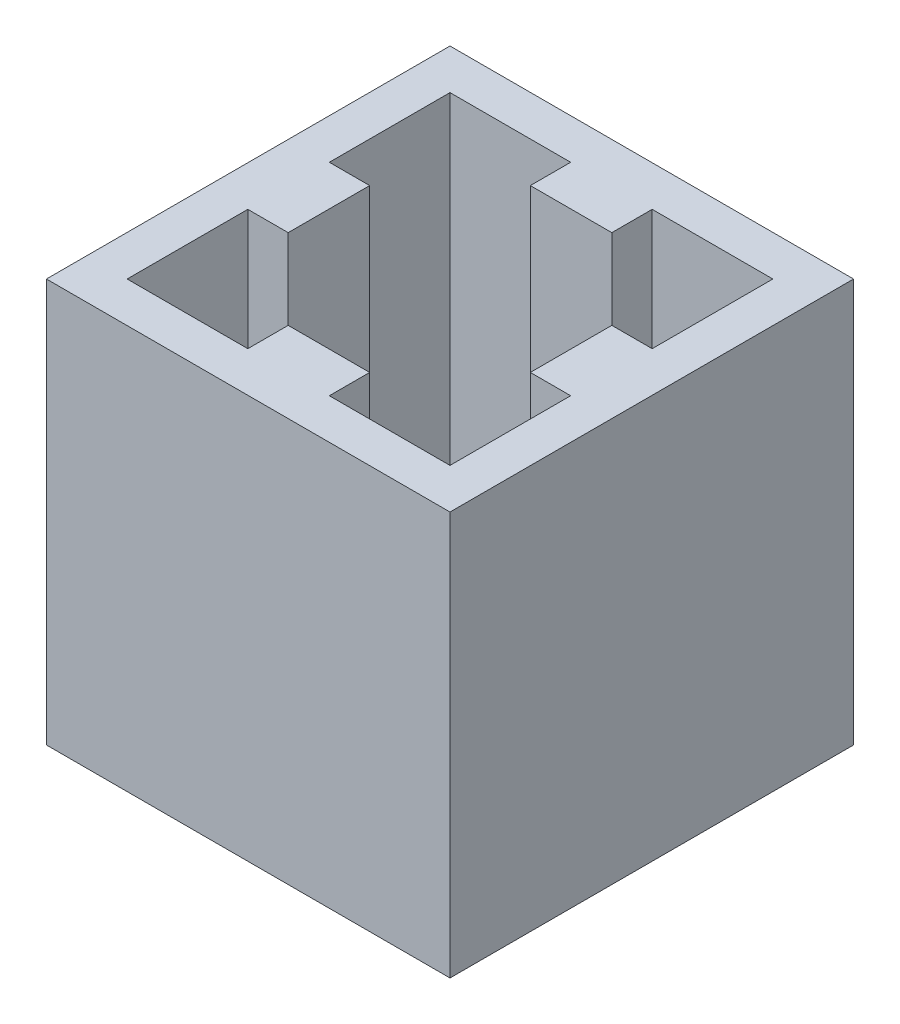
ISO-10303-21;
HEADER;
FILE_DESCRIPTION(('STEP AP214'),'2;1');
FILE_NAME('part.step','',(''),(''),'','','');
FILE_SCHEMA(('AUTOMOTIVE_DESIGN { 1 0 10303 214 1 1 1 1 }'));
ENDSEC;
DATA;
#1=APPLICATION_CONTEXT('core data for automotive mechanical design processes');
#2=APPLICATION_PROTOCOL_DEFINITION('international standard','automotive_design',2000,#1);
#3=PRODUCT_CONTEXT('',#1,'mechanical');
#4=PRODUCT('Part','Part','',(#3));
#5=PRODUCT_RELATED_PRODUCT_CATEGORY('part','',(#4));
#6=PRODUCT_DEFINITION_FORMATION('','',#4);
#7=PRODUCT_DEFINITION_CONTEXT('part definition',#1,'design');
#8=PRODUCT_DEFINITION('design','',#6,#7);
#9=PRODUCT_DEFINITION_SHAPE('','',#8);
#10=(LENGTH_UNIT() NAMED_UNIT(*) SI_UNIT(.MILLI.,.METRE.));
#11=(NAMED_UNIT(*) PLANE_ANGLE_UNIT() SI_UNIT($,.RADIAN.));
#12=(NAMED_UNIT(*) SI_UNIT($,.STERADIAN.) SOLID_ANGLE_UNIT());
#13=UNCERTAINTY_MEASURE_WITH_UNIT(LENGTH_MEASURE(1.E-05),#10,'distance_accuracy_value','');
#14=(GEOMETRIC_REPRESENTATION_CONTEXT(3) GLOBAL_UNCERTAINTY_ASSIGNED_CONTEXT((#13)) GLOBAL_UNIT_ASSIGNED_CONTEXT((#10,
#11,#12)) REPRESENTATION_CONTEXT('',''));
#15=CARTESIAN_POINT('',(0.,0.,0.));
#16=DIRECTION('',(0.,0.,1.));
#17=DIRECTION('',(1.,0.,0.));
#18=AXIS2_PLACEMENT_3D('',#15,#16,#17);
#19=CARTESIAN_POINT('',(-12.7,25.4,-12.7));
#20=DIRECTION('',(0.,0.,-1.));
#21=DIRECTION('',(-1.,0.,0.));
#22=AXIS2_PLACEMENT_3D('',#19,#20,#21);
#23=PLANE('',#22);
#24=DIRECTION('',(1.,0.,0.));
#25=VECTOR('',#24,1.);
#26=CARTESIAN_POINT('',(-12.7,0.,-12.7));
#27=LINE('',#26,#25);
#28=CARTESIAN_POINT('',(-12.7,0.,-12.7));
#29=VERTEX_POINT('',#28);
#30=CARTESIAN_POINT('',(12.7,0.,-12.7));
#31=VERTEX_POINT('',#30);
#32=EDGE_CURVE('E338',#29,#31,#27,.T.);
#33=ORIENTED_EDGE('',*,*,#32,.F.);
#34=DIRECTION('',(0.,-1.,0.));
#35=VECTOR('',#34,1.);
#36=CARTESIAN_POINT('',(-12.7,25.4,-12.7));
#37=LINE('',#36,#35);
#38=CARTESIAN_POINT('',(-12.7,25.4,-12.7));
#39=VERTEX_POINT('',#38);
#40=EDGE_CURVE('E11',#39,#29,#37,.T.);
#41=ORIENTED_EDGE('',*,*,#40,.F.);
#42=DIRECTION('',(1.,0.,0.));
#43=VECTOR('',#42,1.);
#44=CARTESIAN_POINT('',(-12.7,25.4,-12.7));
#45=LINE('',#44,#43);
#46=CARTESIAN_POINT('',(12.7,25.4,-12.7));
#47=VERTEX_POINT('',#46);
#48=EDGE_CURVE('E374',#39,#47,#45,.T.);
#49=ORIENTED_EDGE('',*,*,#48,.T.);
#50=DIRECTION('',(0.,-1.,0.));
#51=VECTOR('',#50,1.);
#52=CARTESIAN_POINT('',(12.7,25.4,-12.7));
#53=LINE('',#52,#51);
#54=EDGE_CURVE('E42',#47,#31,#53,.T.);
#55=ORIENTED_EDGE('',*,*,#54,.T.);
#56=EDGE_LOOP('',(#33,#41,#49,#55));
#57=FACE_BOUND('',#56,.T.);
#58=ADVANCED_FACE('F39',(#57),#23,.T.);
#59=CARTESIAN_POINT('',(-12.7,25.4,12.7));
#60=DIRECTION('',(-1.,0.,0.));
#61=DIRECTION('',(0.,0.,1.));
#62=AXIS2_PLACEMENT_3D('',#59,#60,#61);
#63=PLANE('',#62);
#64=DIRECTION('',(0.,0.,-1.));
#65=VECTOR('',#64,1.);
#66=CARTESIAN_POINT('',(-12.7,0.,12.7));
#67=LINE('',#66,#65);
#68=CARTESIAN_POINT('',(-12.7,0.,12.7));
#69=VERTEX_POINT('',#68);
#70=EDGE_CURVE('E376',#69,#29,#67,.T.);
#71=ORIENTED_EDGE('',*,*,#70,.F.);
#72=DIRECTION('',(0.,-1.,0.));
#73=VECTOR('',#72,1.);
#74=CARTESIAN_POINT('',(-12.7,25.4,12.7));
#75=LINE('',#74,#73);
#76=CARTESIAN_POINT('',(-12.7,25.4,12.7));
#77=VERTEX_POINT('',#76);
#78=EDGE_CURVE('E47',#77,#69,#75,.T.);
#79=ORIENTED_EDGE('',*,*,#78,.F.);
#80=DIRECTION('',(0.,0.,-1.));
#81=VECTOR('',#80,1.);
#82=CARTESIAN_POINT('',(-12.7,25.4,12.7));
#83=LINE('',#82,#81);
#84=EDGE_CURVE('E380',#77,#39,#83,.T.);
#85=ORIENTED_EDGE('',*,*,#84,.T.);
#86=ORIENTED_EDGE('',*,*,#40,.T.);
#87=EDGE_LOOP('',(#71,#79,#85,#86));
#88=FACE_BOUND('',#87,.T.);
#89=ADVANCED_FACE('F400',(#88),#63,.T.);
#90=CARTESIAN_POINT('',(-12.7,25.4,12.7));
#91=DIRECTION('',(0.,0.,-1.));
#92=DIRECTION('',(-1.,0.,0.));
#93=AXIS2_PLACEMENT_3D('',#90,#91,#92);
#94=PLANE('',#93);
#95=DIRECTION('',(1.,0.,0.));
#96=VECTOR('',#95,1.);
#97=CARTESIAN_POINT('',(-12.7,0.,12.7));
#98=LINE('',#97,#96);
#99=CARTESIAN_POINT('',(12.7,0.,12.7));
#100=VERTEX_POINT('',#99);
#101=EDGE_CURVE('E387',#69,#100,#98,.T.);
#102=ORIENTED_EDGE('',*,*,#101,.T.);
#103=DIRECTION('',(0.,-1.,0.));
#104=VECTOR('',#103,1.);
#105=CARTESIAN_POINT('',(12.7,25.4,12.7));
#106=LINE('',#105,#104);
#107=CARTESIAN_POINT('',(12.7,25.4,12.7));
#108=VERTEX_POINT('',#107);
#109=EDGE_CURVE('E391',#108,#100,#106,.T.);
#110=ORIENTED_EDGE('',*,*,#109,.F.);
#111=DIRECTION('',(1.,0.,0.));
#112=VECTOR('',#111,1.);
#113=CARTESIAN_POINT('',(-12.7,25.4,12.7));
#114=LINE('',#113,#112);
#115=EDGE_CURVE('E378',#77,#108,#114,.T.);
#116=ORIENTED_EDGE('',*,*,#115,.F.);
#117=ORIENTED_EDGE('',*,*,#78,.T.);
#118=EDGE_LOOP('',(#102,#110,#116,#117));
#119=FACE_BOUND('',#118,.T.);
#120=ADVANCED_FACE('F404',(#119),#94,.F.);
#121=CARTESIAN_POINT('',(12.7,25.4,12.7));
#122=DIRECTION('',(-1.,0.,0.));
#123=DIRECTION('',(0.,0.,1.));
#124=AXIS2_PLACEMENT_3D('',#121,#122,#123);
#125=PLANE('',#124);
#126=DIRECTION('',(0.,0.,-1.));
#127=VECTOR('',#126,1.);
#128=CARTESIAN_POINT('',(12.7,0.,12.7));
#129=LINE('',#128,#127);
#130=EDGE_CURVE('E384',#100,#31,#129,.T.);
#131=ORIENTED_EDGE('',*,*,#130,.T.);
#132=ORIENTED_EDGE('',*,*,#54,.F.);
#133=DIRECTION('',(0.,0.,-1.));
#134=VECTOR('',#133,1.);
#135=CARTESIAN_POINT('',(12.7,25.4,12.7));
#136=LINE('',#135,#134);
#137=EDGE_CURVE('E88',#108,#47,#136,.T.);
#138=ORIENTED_EDGE('',*,*,#137,.F.);
#139=ORIENTED_EDGE('',*,*,#109,.T.);
#140=EDGE_LOOP('',(#131,#132,#138,#139));
#141=FACE_BOUND('',#140,.T.);
#142=ADVANCED_FACE('F396',(#141),#125,.F.);
#143=CARTESIAN_POINT('',(0.,25.4,0.));
#144=DIRECTION('',(0.,1.,0.));
#145=DIRECTION('',(0.,0.,1.));
#146=AXIS2_PLACEMENT_3D('',#143,#144,#145);
#147=PLANE('',#146);
#148=DIRECTION('',(0.,0.,-1.));
#149=VECTOR('',#148,1.);
#150=CARTESIAN_POINT('',(10.16,25.4,-2.56512278395392));
#151=LINE('',#150,#149);
#152=CARTESIAN_POINT('',(10.16,25.4,-2.56512278395392));
#153=VERTEX_POINT('',#152);
#154=CARTESIAN_POINT('',(10.16,25.4,-10.16));
#155=VERTEX_POINT('',#154);
#156=EDGE_CURVE('E55',#153,#155,#151,.T.);
#157=ORIENTED_EDGE('',*,*,#156,.F.);
#158=DIRECTION('',(1.,0.,0.));
#159=VECTOR('',#158,1.);
#160=CARTESIAN_POINT('',(10.16,25.4,-2.56512278395392));
#161=LINE('',#160,#159);
#162=CARTESIAN_POINT('',(7.62,25.4,-2.56512278395392));
#163=VERTEX_POINT('',#162);
#164=EDGE_CURVE('E228',#163,#153,#161,.T.);
#165=ORIENTED_EDGE('',*,*,#164,.F.);
#166=DIRECTION('',(0.,0.,-1.));
#167=VECTOR('',#166,1.);
#168=CARTESIAN_POINT('',(7.62,25.4,-2.56512278395392));
#169=LINE('',#168,#167);
#170=CARTESIAN_POINT('',(7.62,25.4,2.56512278395392));
#171=VERTEX_POINT('',#170);
#172=EDGE_CURVE('E231',#171,#163,#169,.T.);
#173=ORIENTED_EDGE('',*,*,#172,.F.);
#174=DIRECTION('',(-1.,0.,0.));
#175=VECTOR('',#174,1.);
#176=CARTESIAN_POINT('',(7.62,25.4,2.56512278395392));
#177=LINE('',#176,#175);
#178=CARTESIAN_POINT('',(10.16,25.4,2.56512278395392));
#179=VERTEX_POINT('',#178);
#180=EDGE_CURVE('E331',#179,#171,#177,.T.);
#181=ORIENTED_EDGE('',*,*,#180,.F.);
#182=DIRECTION('',(0.,0.,-1.));
#183=VECTOR('',#182,1.);
#184=CARTESIAN_POINT('',(10.16,25.4,10.16));
#185=LINE('',#184,#183);
#186=CARTESIAN_POINT('',(10.16,25.4,10.16));
#187=VERTEX_POINT('',#186);
#188=EDGE_CURVE('E328',#187,#179,#185,.T.);
#189=ORIENTED_EDGE('',*,*,#188,.F.);
#190=DIRECTION('',(1.,0.,0.));
#191=VECTOR('',#190,1.);
#192=CARTESIAN_POINT('',(2.56512278395389,25.4,10.16));
#193=LINE('',#192,#191);
#194=CARTESIAN_POINT('',(2.56512278395389,25.4,10.16));
#195=VERTEX_POINT('',#194);
#196=EDGE_CURVE('E325',#195,#187,#193,.T.);
#197=ORIENTED_EDGE('',*,*,#196,.F.);
#198=DIRECTION('',(0.,0.,1.));
#199=VECTOR('',#198,1.);
#200=CARTESIAN_POINT('',(2.56512278395389,25.4,10.16));
#201=LINE('',#200,#199);
#202=CARTESIAN_POINT('',(2.56512278395389,25.4,7.62000000000001));
#203=VERTEX_POINT('',#202);
#204=EDGE_CURVE('E322',#203,#195,#201,.T.);
#205=ORIENTED_EDGE('',*,*,#204,.F.);
#206=DIRECTION('',(1.,0.,0.));
#207=VECTOR('',#206,1.);
#208=CARTESIAN_POINT('',(2.56512278395389,25.4,7.62000000000001));
#209=LINE('',#208,#207);
#210=CARTESIAN_POINT('',(-2.56512278395395,25.4,7.61999999999999));
#211=VERTEX_POINT('',#210);
#212=EDGE_CURVE('E319',#211,#203,#209,.T.);
#213=ORIENTED_EDGE('',*,*,#212,.F.);
#214=DIRECTION('',(0.,0.,-1.));
#215=VECTOR('',#214,1.);
#216=CARTESIAN_POINT('',(-2.56512278395395,25.4,7.61999999999999));
#217=LINE('',#216,#215);
#218=CARTESIAN_POINT('',(-2.56512278395396,25.4,10.16));
#219=VERTEX_POINT('',#218);
#220=EDGE_CURVE('E316',#219,#211,#217,.T.);
#221=ORIENTED_EDGE('',*,*,#220,.F.);
#222=DIRECTION('',(1.,0.,0.));
#223=VECTOR('',#222,1.);
#224=CARTESIAN_POINT('',(-10.16,25.4,10.16));
#225=LINE('',#224,#223);
#226=CARTESIAN_POINT('',(-10.16,25.4,10.16));
#227=VERTEX_POINT('',#226);
#228=EDGE_CURVE('E313',#227,#219,#225,.T.);
#229=ORIENTED_EDGE('',*,*,#228,.F.);
#230=DIRECTION('',(0.,0.,1.));
#231=VECTOR('',#230,1.);
#232=CARTESIAN_POINT('',(-10.16,25.4,2.56512278395385));
#233=LINE('',#232,#231);
#234=CARTESIAN_POINT('',(-10.16,25.4,2.56512278395385));
#235=VERTEX_POINT('',#234);
#236=EDGE_CURVE('E310',#235,#227,#233,.T.);
#237=ORIENTED_EDGE('',*,*,#236,.F.);
#238=DIRECTION('',(-1.,0.,0.));
#239=VECTOR('',#238,1.);
#240=CARTESIAN_POINT('',(-10.16,25.4,2.56512278395385));
#241=LINE('',#240,#239);
#242=CARTESIAN_POINT('',(-7.62000000000001,25.4,2.56512278395387));
#243=VERTEX_POINT('',#242);
#244=EDGE_CURVE('E307',#243,#235,#241,.T.);
#245=ORIENTED_EDGE('',*,*,#244,.F.);
#246=DIRECTION('',(0.,0.,1.));
#247=VECTOR('',#246,1.);
#248=CARTESIAN_POINT('',(-7.62000000000001,25.4,2.56512278395387));
#249=LINE('',#248,#247);
#250=CARTESIAN_POINT('',(-7.61999999999998,25.4,-2.56512278395397));
#251=VERTEX_POINT('',#250);
#252=EDGE_CURVE('E304',#251,#243,#249,.T.);
#253=ORIENTED_EDGE('',*,*,#252,.F.);
#254=DIRECTION('',(1.,0.,0.));
#255=VECTOR('',#254,1.);
#256=CARTESIAN_POINT('',(-7.61999999999998,25.4,-2.56512278395397));
#257=LINE('',#256,#255);
#258=CARTESIAN_POINT('',(-10.16,25.4,-2.56512278395399));
#259=VERTEX_POINT('',#258);
#260=EDGE_CURVE('E301',#259,#251,#257,.T.);
#261=ORIENTED_EDGE('',*,*,#260,.F.);
#262=DIRECTION('',(0.,0.,1.));
#263=VECTOR('',#262,1.);
#264=CARTESIAN_POINT('',(-10.16,25.4,-10.16));
#265=LINE('',#264,#263);
#266=CARTESIAN_POINT('',(-10.16,25.4,-10.16));
#267=VERTEX_POINT('',#266);
#268=EDGE_CURVE('E298',#267,#259,#265,.T.);
#269=ORIENTED_EDGE('',*,*,#268,.F.);
#270=DIRECTION('',(-1.,0.,0.));
#271=VECTOR('',#270,1.);
#272=CARTESIAN_POINT('',(-2.56512278395382,25.4,-10.16));
#273=LINE('',#272,#271);
#274=CARTESIAN_POINT('',(-2.56512278395382,25.4,-10.16));
#275=VERTEX_POINT('',#274);
#276=EDGE_CURVE('E295',#275,#267,#273,.T.);
#277=ORIENTED_EDGE('',*,*,#276,.F.);
#278=DIRECTION('',(0.,0.,-1.));
#279=VECTOR('',#278,1.);
#280=CARTESIAN_POINT('',(-2.56512278395382,25.4,-10.16));
#281=LINE('',#280,#279);
#282=CARTESIAN_POINT('',(-2.56512278395384,25.4,-7.62000000000002));
#283=VERTEX_POINT('',#282);
#284=EDGE_CURVE('E292',#283,#275,#281,.T.);
#285=ORIENTED_EDGE('',*,*,#284,.F.);
#286=DIRECTION('',(-1.,0.,0.));
#287=VECTOR('',#286,1.);
#288=CARTESIAN_POINT('',(-2.56512278395384,25.4,-7.62000000000002));
#289=LINE('',#288,#287);
#290=CARTESIAN_POINT('',(2.565122783954,25.4,-7.61999999999997));
#291=VERTEX_POINT('',#290);
#292=EDGE_CURVE('E289',#291,#283,#289,.T.);
#293=ORIENTED_EDGE('',*,*,#292,.F.);
#294=DIRECTION('',(0.,0.,1.));
#295=VECTOR('',#294,1.);
#296=CARTESIAN_POINT('',(2.565122783954,25.4,-7.61999999999997));
#297=LINE('',#296,#295);
#298=CARTESIAN_POINT('',(2.56512278395403,25.4,-10.16));
#299=VERTEX_POINT('',#298);
#300=EDGE_CURVE('E286',#299,#291,#297,.T.);
#301=ORIENTED_EDGE('',*,*,#300,.F.);
#302=DIRECTION('',(-1.,0.,0.));
#303=VECTOR('',#302,1.);
#304=CARTESIAN_POINT('',(10.16,25.4,-10.16));
#305=LINE('',#304,#303);
#306=EDGE_CURVE('E284',#155,#299,#305,.T.);
#307=ORIENTED_EDGE('',*,*,#306,.F.);
#308=EDGE_LOOP('',(#157,#165,#173,#181,#189,#197,#205,#213,#221,#229,#237,#245,#253,#261,#269,
#277,#285,#293,#301,#307));
#309=FACE_BOUND('',#308,.T.);
#310=ORIENTED_EDGE('',*,*,#48,.F.);
#311=ORIENTED_EDGE('',*,*,#84,.F.);
#312=ORIENTED_EDGE('',*,*,#115,.T.);
#313=ORIENTED_EDGE('',*,*,#137,.T.);
#314=EDGE_LOOP('',(#310,#311,#312,#313));
#315=FACE_BOUND('',#314,.T.);
#316=ADVANCED_FACE('F405',(#309,#315),#147,.T.);
#317=CARTESIAN_POINT('',(0.,0.,0.));
#318=DIRECTION('',(0.,1.,0.));
#319=DIRECTION('',(0.,0.,1.));
#320=AXIS2_PLACEMENT_3D('',#317,#318,#319);
#321=PLANE('',#320);
#322=ORIENTED_EDGE('',*,*,#32,.T.);
#323=ORIENTED_EDGE('',*,*,#130,.F.);
#324=ORIENTED_EDGE('',*,*,#101,.F.);
#325=ORIENTED_EDGE('',*,*,#70,.T.);
#326=EDGE_LOOP('',(#322,#323,#324,#325));
#327=FACE_BOUND('',#326,.T.);
#328=ADVANCED_FACE('F399',(#327),#321,.F.);
#329=CARTESIAN_POINT('',(10.16,2.54,-2.56512278395392));
#330=DIRECTION('',(1.,0.,0.));
#331=DIRECTION('',(0.,0.,-1.));
#332=AXIS2_PLACEMENT_3D('',#329,#330,#331);
#333=PLANE('',#332);
#334=ORIENTED_EDGE('',*,*,#156,.T.);
#335=DIRECTION('',(0.,1.,0.));
#336=VECTOR('',#335,1.);
#337=CARTESIAN_POINT('',(10.16,2.54,-10.16));
#338=LINE('',#337,#336);
#339=CARTESIAN_POINT('',(10.16,2.54,-10.16));
#340=VERTEX_POINT('',#339);
#341=EDGE_CURVE('E205',#340,#155,#338,.T.);
#342=ORIENTED_EDGE('',*,*,#341,.F.);
#343=DIRECTION('',(0.,0.,-1.));
#344=VECTOR('',#343,1.);
#345=CARTESIAN_POINT('',(10.16,2.54,-2.56512278395392));
#346=LINE('',#345,#344);
#347=CARTESIAN_POINT('',(10.16,2.54,-2.56512278395392));
#348=VERTEX_POINT('',#347);
#349=EDGE_CURVE('E209',#348,#340,#346,.T.);
#350=ORIENTED_EDGE('',*,*,#349,.F.);
#351=DIRECTION('',(0.,1.,0.));
#352=VECTOR('',#351,1.);
#353=CARTESIAN_POINT('',(10.16,2.54,-2.56512278395392));
#354=LINE('',#353,#352);
#355=EDGE_CURVE('E336',#348,#153,#354,.T.);
#356=ORIENTED_EDGE('',*,*,#355,.T.);
#357=EDGE_LOOP('',(#334,#342,#350,#356));
#358=FACE_BOUND('',#357,.T.);
#359=ADVANCED_FACE('F207',(#358),#333,.F.);
#360=CARTESIAN_POINT('',(10.16,2.54,-2.56512278395392));
#361=DIRECTION('',(0.,0.,1.));
#362=DIRECTION('',(1.,0.,0.));
#363=AXIS2_PLACEMENT_3D('',#360,#361,#362);
#364=PLANE('',#363);
#365=ORIENTED_EDGE('',*,*,#164,.T.);
#366=ORIENTED_EDGE('',*,*,#355,.F.);
#367=DIRECTION('',(1.,0.,0.));
#368=VECTOR('',#367,1.);
#369=CARTESIAN_POINT('',(10.16,2.54,-2.56512278395392));
#370=LINE('',#369,#368);
#371=CARTESIAN_POINT('',(7.62,2.54,-2.56512278395392));
#372=VERTEX_POINT('',#371);
#373=EDGE_CURVE('E215',#372,#348,#370,.T.);
#374=ORIENTED_EDGE('',*,*,#373,.F.);
#375=DIRECTION('',(0.,1.,0.));
#376=VECTOR('',#375,1.);
#377=CARTESIAN_POINT('',(7.62,2.54,-2.56512278395392));
#378=LINE('',#377,#376);
#379=EDGE_CURVE('E339',#372,#163,#378,.T.);
#380=ORIENTED_EDGE('',*,*,#379,.T.);
#381=EDGE_LOOP('',(#365,#366,#374,#380));
#382=FACE_BOUND('',#381,.T.);
#383=ADVANCED_FACE('F452',(#382),#364,.F.);
#384=CARTESIAN_POINT('',(7.62,2.54,-2.56512278395392));
#385=DIRECTION('',(1.,0.,0.));
#386=DIRECTION('',(0.,0.,-1.));
#387=AXIS2_PLACEMENT_3D('',#384,#385,#386);
#388=PLANE('',#387);
#389=ORIENTED_EDGE('',*,*,#172,.T.);
#390=ORIENTED_EDGE('',*,*,#379,.F.);
#391=DIRECTION('',(0.,0.,-1.));
#392=VECTOR('',#391,1.);
#393=CARTESIAN_POINT('',(7.62,2.54,-2.56512278395392));
#394=LINE('',#393,#392);
#395=CARTESIAN_POINT('',(7.62,2.54,2.56512278395392));
#396=VERTEX_POINT('',#395);
#397=EDGE_CURVE('E280',#396,#372,#394,.T.);
#398=ORIENTED_EDGE('',*,*,#397,.F.);
#399=DIRECTION('',(0.,1.,0.));
#400=VECTOR('',#399,1.);
#401=CARTESIAN_POINT('',(7.62,2.54,2.56512278395392));
#402=LINE('',#401,#400);
#403=EDGE_CURVE('E341',#396,#171,#402,.T.);
#404=ORIENTED_EDGE('',*,*,#403,.T.);
#405=EDGE_LOOP('',(#389,#390,#398,#404));
#406=FACE_BOUND('',#405,.T.);
#407=ADVANCED_FACE('F461',(#406),#388,.F.);
#408=CARTESIAN_POINT('',(7.62,2.54,2.56512278395392));
#409=DIRECTION('',(0.,0.,-1.));
#410=DIRECTION('',(-1.,0.,0.));
#411=AXIS2_PLACEMENT_3D('',#408,#409,#410);
#412=PLANE('',#411);
#413=ORIENTED_EDGE('',*,*,#180,.T.);
#414=ORIENTED_EDGE('',*,*,#403,.F.);
#415=DIRECTION('',(-1.,0.,0.));
#416=VECTOR('',#415,1.);
#417=CARTESIAN_POINT('',(7.62,2.54,2.56512278395392));
#418=LINE('',#417,#416);
#419=CARTESIAN_POINT('',(10.16,2.54,2.56512278395392));
#420=VERTEX_POINT('',#419);
#421=EDGE_CURVE('E277',#420,#396,#418,.T.);
#422=ORIENTED_EDGE('',*,*,#421,.F.);
#423=DIRECTION('',(0.,1.,0.));
#424=VECTOR('',#423,1.);
#425=CARTESIAN_POINT('',(10.16,2.54,2.56512278395392));
#426=LINE('',#425,#424);
#427=EDGE_CURVE('E343',#420,#179,#426,.T.);
#428=ORIENTED_EDGE('',*,*,#427,.T.);
#429=EDGE_LOOP('',(#413,#414,#422,#428));
#430=FACE_BOUND('',#429,.T.);
#431=ADVANCED_FACE('F472',(#430),#412,.F.);
#432=CARTESIAN_POINT('',(10.16,2.54,10.16));
#433=DIRECTION('',(1.,0.,0.));
#434=DIRECTION('',(0.,0.,-1.));
#435=AXIS2_PLACEMENT_3D('',#432,#433,#434);
#436=PLANE('',#435);
#437=ORIENTED_EDGE('',*,*,#188,.T.);
#438=ORIENTED_EDGE('',*,*,#427,.F.);
#439=DIRECTION('',(0.,0.,-1.));
#440=VECTOR('',#439,1.);
#441=CARTESIAN_POINT('',(10.16,2.54,10.16));
#442=LINE('',#441,#440);
#443=CARTESIAN_POINT('',(10.16,2.54,10.16));
#444=VERTEX_POINT('',#443);
#445=EDGE_CURVE('E274',#444,#420,#442,.T.);
#446=ORIENTED_EDGE('',*,*,#445,.F.);
#447=DIRECTION('',(0.,1.,0.));
#448=VECTOR('',#447,1.);
#449=CARTESIAN_POINT('',(10.16,2.54,10.16));
#450=LINE('',#449,#448);
#451=EDGE_CURVE('E345',#444,#187,#450,.T.);
#452=ORIENTED_EDGE('',*,*,#451,.T.);
#453=EDGE_LOOP('',(#437,#438,#446,#452));
#454=FACE_BOUND('',#453,.T.);
#455=ADVANCED_FACE('F483',(#454),#436,.F.);
#456=CARTESIAN_POINT('',(2.56512278395389,2.54,10.16));
#457=DIRECTION('',(0.,0.,1.));
#458=DIRECTION('',(1.,0.,0.));
#459=AXIS2_PLACEMENT_3D('',#456,#457,#458);
#460=PLANE('',#459);
#461=ORIENTED_EDGE('',*,*,#196,.T.);
#462=ORIENTED_EDGE('',*,*,#451,.F.);
#463=DIRECTION('',(1.,0.,0.));
#464=VECTOR('',#463,1.);
#465=CARTESIAN_POINT('',(2.56512278395389,2.54,10.16));
#466=LINE('',#465,#464);
#467=CARTESIAN_POINT('',(2.56512278395389,2.54,10.16));
#468=VERTEX_POINT('',#467);
#469=EDGE_CURVE('E271',#468,#444,#466,.T.);
#470=ORIENTED_EDGE('',*,*,#469,.F.);
#471=DIRECTION('',(0.,1.,0.));
#472=VECTOR('',#471,1.);
#473=CARTESIAN_POINT('',(2.56512278395389,2.54,10.16));
#474=LINE('',#473,#472);
#475=EDGE_CURVE('E347',#468,#195,#474,.T.);
#476=ORIENTED_EDGE('',*,*,#475,.T.);
#477=EDGE_LOOP('',(#461,#462,#470,#476));
#478=FACE_BOUND('',#477,.T.);
#479=ADVANCED_FACE('F494',(#478),#460,.F.);
#480=CARTESIAN_POINT('',(2.56512278395389,2.54,10.16));
#481=DIRECTION('',(-1.,0.,0.));
#482=DIRECTION('',(0.,0.,1.));
#483=AXIS2_PLACEMENT_3D('',#480,#481,#482);
#484=PLANE('',#483);
#485=ORIENTED_EDGE('',*,*,#204,.T.);
#486=ORIENTED_EDGE('',*,*,#475,.F.);
#487=DIRECTION('',(0.,0.,1.));
#488=VECTOR('',#487,1.);
#489=CARTESIAN_POINT('',(2.56512278395389,2.54,10.16));
#490=LINE('',#489,#488);
#491=CARTESIAN_POINT('',(2.56512278395389,2.54,7.62000000000001));
#492=VERTEX_POINT('',#491);
#493=EDGE_CURVE('E268',#492,#468,#490,.T.);
#494=ORIENTED_EDGE('',*,*,#493,.F.);
#495=DIRECTION('',(0.,1.,0.));
#496=VECTOR('',#495,1.);
#497=CARTESIAN_POINT('',(2.56512278395389,2.54,7.62000000000001));
#498=LINE('',#497,#496);
#499=EDGE_CURVE('E349',#492,#203,#498,.T.);
#500=ORIENTED_EDGE('',*,*,#499,.T.);
#501=EDGE_LOOP('',(#485,#486,#494,#500));
#502=FACE_BOUND('',#501,.T.);
#503=ADVANCED_FACE('F505',(#502),#484,.F.);
#504=CARTESIAN_POINT('',(2.56512278395389,2.54,7.62000000000001));
#505=DIRECTION('',(0.,0.,1.));
#506=DIRECTION('',(1.,0.,0.));
#507=AXIS2_PLACEMENT_3D('',#504,#505,#506);
#508=PLANE('',#507);
#509=ORIENTED_EDGE('',*,*,#212,.T.);
#510=ORIENTED_EDGE('',*,*,#499,.F.);
#511=DIRECTION('',(1.,0.,0.));
#512=VECTOR('',#511,1.);
#513=CARTESIAN_POINT('',(2.56512278395389,2.54,7.62000000000001));
#514=LINE('',#513,#512);
#515=CARTESIAN_POINT('',(-2.56512278395395,2.54,7.61999999999999));
#516=VERTEX_POINT('',#515);
#517=EDGE_CURVE('E265',#516,#492,#514,.T.);
#518=ORIENTED_EDGE('',*,*,#517,.F.);
#519=DIRECTION('',(0.,1.,0.));
#520=VECTOR('',#519,1.);
#521=CARTESIAN_POINT('',(-2.56512278395395,2.54,7.61999999999999));
#522=LINE('',#521,#520);
#523=EDGE_CURVE('E351',#516,#211,#522,.T.);
#524=ORIENTED_EDGE('',*,*,#523,.T.);
#525=EDGE_LOOP('',(#509,#510,#518,#524));
#526=FACE_BOUND('',#525,.T.);
#527=ADVANCED_FACE('F516',(#526),#508,.F.);
#528=CARTESIAN_POINT('',(-2.56512278395395,2.54,7.61999999999999));
#529=DIRECTION('',(1.,0.,0.));
#530=DIRECTION('',(0.,0.,-1.));
#531=AXIS2_PLACEMENT_3D('',#528,#529,#530);
#532=PLANE('',#531);
#533=ORIENTED_EDGE('',*,*,#220,.T.);
#534=ORIENTED_EDGE('',*,*,#523,.F.);
#535=DIRECTION('',(0.,0.,-1.));
#536=VECTOR('',#535,1.);
#537=CARTESIAN_POINT('',(-2.56512278395395,2.54,7.61999999999999));
#538=LINE('',#537,#536);
#539=CARTESIAN_POINT('',(-2.56512278395396,2.54,10.16));
#540=VERTEX_POINT('',#539);
#541=EDGE_CURVE('E262',#540,#516,#538,.T.);
#542=ORIENTED_EDGE('',*,*,#541,.F.);
#543=DIRECTION('',(0.,1.,0.));
#544=VECTOR('',#543,1.);
#545=CARTESIAN_POINT('',(-2.56512278395396,2.54,10.16));
#546=LINE('',#545,#544);
#547=EDGE_CURVE('E353',#540,#219,#546,.T.);
#548=ORIENTED_EDGE('',*,*,#547,.T.);
#549=EDGE_LOOP('',(#533,#534,#542,#548));
#550=FACE_BOUND('',#549,.T.);
#551=ADVANCED_FACE('F527',(#550),#532,.F.);
#552=CARTESIAN_POINT('',(-10.16,2.54,10.16));
#553=DIRECTION('',(0.,0.,1.));
#554=DIRECTION('',(1.,0.,0.));
#555=AXIS2_PLACEMENT_3D('',#552,#553,#554);
#556=PLANE('',#555);
#557=ORIENTED_EDGE('',*,*,#228,.T.);
#558=ORIENTED_EDGE('',*,*,#547,.F.);
#559=DIRECTION('',(1.,0.,0.));
#560=VECTOR('',#559,1.);
#561=CARTESIAN_POINT('',(-10.16,2.54,10.16));
#562=LINE('',#561,#560);
#563=CARTESIAN_POINT('',(-10.16,2.54,10.16));
#564=VERTEX_POINT('',#563);
#565=EDGE_CURVE('E259',#564,#540,#562,.T.);
#566=ORIENTED_EDGE('',*,*,#565,.F.);
#567=DIRECTION('',(0.,1.,0.));
#568=VECTOR('',#567,1.);
#569=CARTESIAN_POINT('',(-10.16,2.54,10.16));
#570=LINE('',#569,#568);
#571=EDGE_CURVE('E355',#564,#227,#570,.T.);
#572=ORIENTED_EDGE('',*,*,#571,.T.);
#573=EDGE_LOOP('',(#557,#558,#566,#572));
#574=FACE_BOUND('',#573,.T.);
#575=ADVANCED_FACE('F538',(#574),#556,.F.);
#576=CARTESIAN_POINT('',(-10.16,2.54,2.56512278395385));
#577=DIRECTION('',(-1.,0.,0.));
#578=DIRECTION('',(0.,0.,1.));
#579=AXIS2_PLACEMENT_3D('',#576,#577,#578);
#580=PLANE('',#579);
#581=ORIENTED_EDGE('',*,*,#236,.T.);
#582=ORIENTED_EDGE('',*,*,#571,.F.);
#583=DIRECTION('',(0.,0.,1.));
#584=VECTOR('',#583,1.);
#585=CARTESIAN_POINT('',(-10.16,2.54,2.56512278395385));
#586=LINE('',#585,#584);
#587=CARTESIAN_POINT('',(-10.16,2.54,2.56512278395385));
#588=VERTEX_POINT('',#587);
#589=EDGE_CURVE('E256',#588,#564,#586,.T.);
#590=ORIENTED_EDGE('',*,*,#589,.F.);
#591=DIRECTION('',(0.,1.,0.));
#592=VECTOR('',#591,1.);
#593=CARTESIAN_POINT('',(-10.16,2.54,2.56512278395385));
#594=LINE('',#593,#592);
#595=EDGE_CURVE('E357',#588,#235,#594,.T.);
#596=ORIENTED_EDGE('',*,*,#595,.T.);
#597=EDGE_LOOP('',(#581,#582,#590,#596));
#598=FACE_BOUND('',#597,.T.);
#599=ADVANCED_FACE('F549',(#598),#580,.F.);
#600=CARTESIAN_POINT('',(-10.16,2.54,2.56512278395385));
#601=DIRECTION('',(0.,0.,-1.));
#602=DIRECTION('',(-1.,0.,0.));
#603=AXIS2_PLACEMENT_3D('',#600,#601,#602);
#604=PLANE('',#603);
#605=ORIENTED_EDGE('',*,*,#244,.T.);
#606=ORIENTED_EDGE('',*,*,#595,.F.);
#607=DIRECTION('',(-1.,0.,0.));
#608=VECTOR('',#607,1.);
#609=CARTESIAN_POINT('',(-10.16,2.54,2.56512278395385));
#610=LINE('',#609,#608);
#611=CARTESIAN_POINT('',(-7.62000000000001,2.54,2.56512278395387));
#612=VERTEX_POINT('',#611);
#613=EDGE_CURVE('E253',#612,#588,#610,.T.);
#614=ORIENTED_EDGE('',*,*,#613,.F.);
#615=DIRECTION('',(0.,1.,0.));
#616=VECTOR('',#615,1.);
#617=CARTESIAN_POINT('',(-7.62000000000001,2.54,2.56512278395387));
#618=LINE('',#617,#616);
#619=EDGE_CURVE('E359',#612,#243,#618,.T.);
#620=ORIENTED_EDGE('',*,*,#619,.T.);
#621=EDGE_LOOP('',(#605,#606,#614,#620));
#622=FACE_BOUND('',#621,.T.);
#623=ADVANCED_FACE('F560',(#622),#604,.F.);
#624=CARTESIAN_POINT('',(-7.62000000000001,2.54,2.56512278395387));
#625=DIRECTION('',(-1.,0.,0.));
#626=DIRECTION('',(0.,0.,1.));
#627=AXIS2_PLACEMENT_3D('',#624,#625,#626);
#628=PLANE('',#627);
#629=ORIENTED_EDGE('',*,*,#252,.T.);
#630=ORIENTED_EDGE('',*,*,#619,.F.);
#631=DIRECTION('',(0.,0.,1.));
#632=VECTOR('',#631,1.);
#633=CARTESIAN_POINT('',(-7.62000000000001,2.54,2.56512278395387));
#634=LINE('',#633,#632);
#635=CARTESIAN_POINT('',(-7.61999999999998,2.54,-2.56512278395397));
#636=VERTEX_POINT('',#635);
#637=EDGE_CURVE('E250',#636,#612,#634,.T.);
#638=ORIENTED_EDGE('',*,*,#637,.F.);
#639=DIRECTION('',(0.,1.,0.));
#640=VECTOR('',#639,1.);
#641=CARTESIAN_POINT('',(-7.61999999999998,2.54,-2.56512278395397));
#642=LINE('',#641,#640);
#643=EDGE_CURVE('E361',#636,#251,#642,.T.);
#644=ORIENTED_EDGE('',*,*,#643,.T.);
#645=EDGE_LOOP('',(#629,#630,#638,#644));
#646=FACE_BOUND('',#645,.T.);
#647=ADVANCED_FACE('F571',(#646),#628,.F.);
#648=CARTESIAN_POINT('',(-7.61999999999998,2.54,-2.56512278395397));
#649=DIRECTION('',(0.,0.,1.));
#650=DIRECTION('',(1.,0.,0.));
#651=AXIS2_PLACEMENT_3D('',#648,#649,#650);
#652=PLANE('',#651);
#653=ORIENTED_EDGE('',*,*,#260,.T.);
#654=ORIENTED_EDGE('',*,*,#643,.F.);
#655=DIRECTION('',(1.,0.,0.));
#656=VECTOR('',#655,1.);
#657=CARTESIAN_POINT('',(-7.61999999999998,2.54,-2.56512278395397));
#658=LINE('',#657,#656);
#659=CARTESIAN_POINT('',(-10.16,2.54,-2.56512278395399));
#660=VERTEX_POINT('',#659);
#661=EDGE_CURVE('E247',#660,#636,#658,.T.);
#662=ORIENTED_EDGE('',*,*,#661,.F.);
#663=DIRECTION('',(0.,1.,0.));
#664=VECTOR('',#663,1.);
#665=CARTESIAN_POINT('',(-10.16,2.54,-2.56512278395399));
#666=LINE('',#665,#664);
#667=EDGE_CURVE('E363',#660,#259,#666,.T.);
#668=ORIENTED_EDGE('',*,*,#667,.T.);
#669=EDGE_LOOP('',(#653,#654,#662,#668));
#670=FACE_BOUND('',#669,.T.);
#671=ADVANCED_FACE('F582',(#670),#652,.F.);
#672=CARTESIAN_POINT('',(-10.16,2.54,-10.16));
#673=DIRECTION('',(-1.,0.,0.));
#674=DIRECTION('',(0.,0.,1.));
#675=AXIS2_PLACEMENT_3D('',#672,#673,#674);
#676=PLANE('',#675);
#677=ORIENTED_EDGE('',*,*,#268,.T.);
#678=ORIENTED_EDGE('',*,*,#667,.F.);
#679=DIRECTION('',(0.,0.,1.));
#680=VECTOR('',#679,1.);
#681=CARTESIAN_POINT('',(-10.16,2.54,-10.16));
#682=LINE('',#681,#680);
#683=CARTESIAN_POINT('',(-10.16,2.54,-10.16));
#684=VERTEX_POINT('',#683);
#685=EDGE_CURVE('E244',#684,#660,#682,.T.);
#686=ORIENTED_EDGE('',*,*,#685,.F.);
#687=DIRECTION('',(0.,1.,0.));
#688=VECTOR('',#687,1.);
#689=CARTESIAN_POINT('',(-10.16,2.54,-10.16));
#690=LINE('',#689,#688);
#691=EDGE_CURVE('E365',#684,#267,#690,.T.);
#692=ORIENTED_EDGE('',*,*,#691,.T.);
#693=EDGE_LOOP('',(#677,#678,#686,#692));
#694=FACE_BOUND('',#693,.T.);
#695=ADVANCED_FACE('F593',(#694),#676,.F.);
#696=CARTESIAN_POINT('',(-2.56512278395382,2.54,-10.16));
#697=DIRECTION('',(0.,0.,-1.));
#698=DIRECTION('',(-1.,0.,0.));
#699=AXIS2_PLACEMENT_3D('',#696,#697,#698);
#700=PLANE('',#699);
#701=ORIENTED_EDGE('',*,*,#276,.T.);
#702=ORIENTED_EDGE('',*,*,#691,.F.);
#703=DIRECTION('',(-1.,0.,0.));
#704=VECTOR('',#703,1.);
#705=CARTESIAN_POINT('',(-2.56512278395382,2.54,-10.16));
#706=LINE('',#705,#704);
#707=CARTESIAN_POINT('',(-2.56512278395382,2.54,-10.16));
#708=VERTEX_POINT('',#707);
#709=EDGE_CURVE('E241',#708,#684,#706,.T.);
#710=ORIENTED_EDGE('',*,*,#709,.F.);
#711=DIRECTION('',(0.,1.,0.));
#712=VECTOR('',#711,1.);
#713=CARTESIAN_POINT('',(-2.56512278395382,2.54,-10.16));
#714=LINE('',#713,#712);
#715=EDGE_CURVE('E367',#708,#275,#714,.T.);
#716=ORIENTED_EDGE('',*,*,#715,.T.);
#717=EDGE_LOOP('',(#701,#702,#710,#716));
#718=FACE_BOUND('',#717,.T.);
#719=ADVANCED_FACE('F604',(#718),#700,.F.);
#720=CARTESIAN_POINT('',(-2.56512278395382,2.54,-10.16));
#721=DIRECTION('',(1.,0.,0.));
#722=DIRECTION('',(0.,0.,-1.));
#723=AXIS2_PLACEMENT_3D('',#720,#721,#722);
#724=PLANE('',#723);
#725=ORIENTED_EDGE('',*,*,#284,.T.);
#726=ORIENTED_EDGE('',*,*,#715,.F.);
#727=DIRECTION('',(0.,0.,-1.));
#728=VECTOR('',#727,1.);
#729=CARTESIAN_POINT('',(-2.56512278395382,2.54,-10.16));
#730=LINE('',#729,#728);
#731=CARTESIAN_POINT('',(-2.56512278395384,2.54,-7.62000000000002));
#732=VERTEX_POINT('',#731);
#733=EDGE_CURVE('E238',#732,#708,#730,.T.);
#734=ORIENTED_EDGE('',*,*,#733,.F.);
#735=DIRECTION('',(0.,1.,0.));
#736=VECTOR('',#735,1.);
#737=CARTESIAN_POINT('',(-2.56512278395384,2.54,-7.62000000000002));
#738=LINE('',#737,#736);
#739=EDGE_CURVE('E369',#732,#283,#738,.T.);
#740=ORIENTED_EDGE('',*,*,#739,.T.);
#741=EDGE_LOOP('',(#725,#726,#734,#740));
#742=FACE_BOUND('',#741,.T.);
#743=ADVANCED_FACE('F615',(#742),#724,.F.);
#744=CARTESIAN_POINT('',(-2.56512278395384,2.54,-7.62000000000002));
#745=DIRECTION('',(0.,0.,-1.));
#746=DIRECTION('',(-1.,0.,0.));
#747=AXIS2_PLACEMENT_3D('',#744,#745,#746);
#748=PLANE('',#747);
#749=ORIENTED_EDGE('',*,*,#292,.T.);
#750=ORIENTED_EDGE('',*,*,#739,.F.);
#751=DIRECTION('',(-1.,0.,0.));
#752=VECTOR('',#751,1.);
#753=CARTESIAN_POINT('',(-2.56512278395384,2.54,-7.62000000000002));
#754=LINE('',#753,#752);
#755=CARTESIAN_POINT('',(2.565122783954,2.54,-7.61999999999997));
#756=VERTEX_POINT('',#755);
#757=EDGE_CURVE('E235',#756,#732,#754,.T.);
#758=ORIENTED_EDGE('',*,*,#757,.F.);
#759=DIRECTION('',(0.,1.,0.));
#760=VECTOR('',#759,1.);
#761=CARTESIAN_POINT('',(2.565122783954,2.54,-7.61999999999997));
#762=LINE('',#761,#760);
#763=EDGE_CURVE('E371',#756,#291,#762,.T.);
#764=ORIENTED_EDGE('',*,*,#763,.T.);
#765=EDGE_LOOP('',(#749,#750,#758,#764));
#766=FACE_BOUND('',#765,.T.);
#767=ADVANCED_FACE('F626',(#766),#748,.F.);
#768=CARTESIAN_POINT('',(2.565122783954,2.54,-7.61999999999997));
#769=DIRECTION('',(-1.,0.,0.));
#770=DIRECTION('',(0.,0.,1.));
#771=AXIS2_PLACEMENT_3D('',#768,#769,#770);
#772=PLANE('',#771);
#773=ORIENTED_EDGE('',*,*,#300,.T.);
#774=ORIENTED_EDGE('',*,*,#763,.F.);
#775=DIRECTION('',(0.,0.,1.));
#776=VECTOR('',#775,1.);
#777=CARTESIAN_POINT('',(2.565122783954,2.54,-7.61999999999997));
#778=LINE('',#777,#776);
#779=CARTESIAN_POINT('',(2.56512278395403,2.54,-10.16));
#780=VERTEX_POINT('',#779);
#781=EDGE_CURVE('E223',#780,#756,#778,.T.);
#782=ORIENTED_EDGE('',*,*,#781,.F.);
#783=DIRECTION('',(0.,1.,0.));
#784=VECTOR('',#783,1.);
#785=CARTESIAN_POINT('',(2.56512278395403,2.54,-10.16));
#786=LINE('',#785,#784);
#787=EDGE_CURVE('E214',#780,#299,#786,.T.);
#788=ORIENTED_EDGE('',*,*,#787,.T.);
#789=EDGE_LOOP('',(#773,#774,#782,#788));
#790=FACE_BOUND('',#789,.T.);
#791=ADVANCED_FACE('F637',(#790),#772,.F.);
#792=CARTESIAN_POINT('',(10.16,2.54,-10.16));
#793=DIRECTION('',(0.,0.,-1.));
#794=DIRECTION('',(-1.,0.,0.));
#795=AXIS2_PLACEMENT_3D('',#792,#793,#794);
#796=PLANE('',#795);
#797=ORIENTED_EDGE('',*,*,#306,.T.);
#798=ORIENTED_EDGE('',*,*,#787,.F.);
#799=DIRECTION('',(-1.,0.,0.));
#800=VECTOR('',#799,1.);
#801=CARTESIAN_POINT('',(10.16,2.54,-10.16));
#802=LINE('',#801,#800);
#803=EDGE_CURVE('E218',#340,#780,#802,.T.);
#804=ORIENTED_EDGE('',*,*,#803,.F.);
#805=ORIENTED_EDGE('',*,*,#341,.T.);
#806=EDGE_LOOP('',(#797,#798,#804,#805));
#807=FACE_BOUND('',#806,.T.);
#808=ADVANCED_FACE('F219',(#807),#796,.F.);
#809=CARTESIAN_POINT('',(0.,2.54,0.));
#810=DIRECTION('',(0.,1.,0.));
#811=DIRECTION('',(0.,0.,1.));
#812=AXIS2_PLACEMENT_3D('',#809,#810,#811);
#813=PLANE('',#812);
#814=ORIENTED_EDGE('',*,*,#349,.T.);
#815=ORIENTED_EDGE('',*,*,#803,.T.);
#816=ORIENTED_EDGE('',*,*,#781,.T.);
#817=ORIENTED_EDGE('',*,*,#757,.T.);
#818=ORIENTED_EDGE('',*,*,#733,.T.);
#819=ORIENTED_EDGE('',*,*,#709,.T.);
#820=ORIENTED_EDGE('',*,*,#685,.T.);
#821=ORIENTED_EDGE('',*,*,#661,.T.);
#822=ORIENTED_EDGE('',*,*,#637,.T.);
#823=ORIENTED_EDGE('',*,*,#613,.T.);
#824=ORIENTED_EDGE('',*,*,#589,.T.);
#825=ORIENTED_EDGE('',*,*,#565,.T.);
#826=ORIENTED_EDGE('',*,*,#541,.T.);
#827=ORIENTED_EDGE('',*,*,#517,.T.);
#828=ORIENTED_EDGE('',*,*,#493,.T.);
#829=ORIENTED_EDGE('',*,*,#469,.T.);
#830=ORIENTED_EDGE('',*,*,#445,.T.);
#831=ORIENTED_EDGE('',*,*,#421,.T.);
#832=ORIENTED_EDGE('',*,*,#397,.T.);
#833=ORIENTED_EDGE('',*,*,#373,.T.);
#834=EDGE_LOOP('',(#814,#815,#816,#817,#818,#819,#820,#821,#822,#823,#824,#825,#826,#827,#828,
#829,#830,#831,#832,#833));
#835=FACE_BOUND('',#834,.T.);
#836=ADVANCED_FACE('F225',(#835),#813,.T.);
#837=CLOSED_SHELL('',(#58,#89,#120,#142,#316,#328,#359,#383,#407,#431,#455,#479,#503,#527,#551,
#575,#599,#623,#647,#671,#695,#719,#743,#767,#791,#808,#836));
#838=MANIFOLD_SOLID_BREP('B2',#837);
#839=ADVANCED_BREP_SHAPE_REPRESENTATION('',(#18,#838),#14);
#840=SHAPE_DEFINITION_REPRESENTATION(#9,#839);
ENDSEC;
END-ISO-10303-21;
